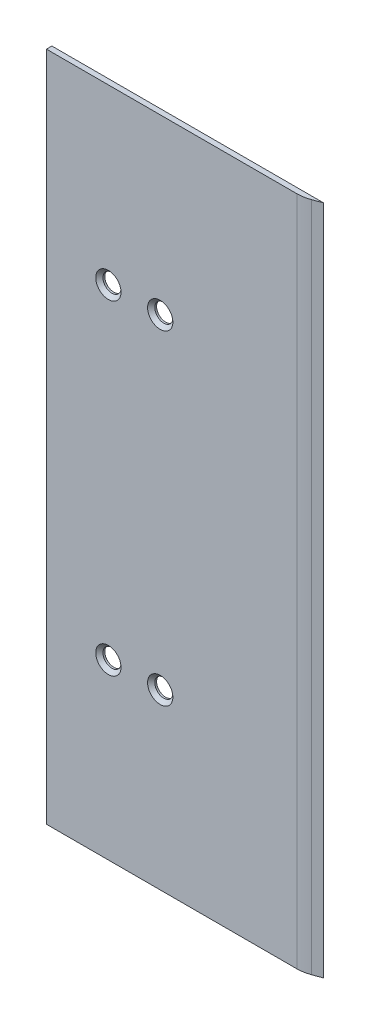
ISO-10303-21;
HEADER;
FILE_DESCRIPTION(('STEP AP214'),'2;1');
FILE_NAME('part.step','',(''),(''),'','','');
FILE_SCHEMA(('AUTOMOTIVE_DESIGN { 1 0 10303 214 1 1 1 1 }'));
ENDSEC;
DATA;
#1=APPLICATION_CONTEXT('core data for automotive mechanical design processes');
#2=APPLICATION_PROTOCOL_DEFINITION('international standard','automotive_design',2000,#1);
#3=PRODUCT_CONTEXT('',#1,'mechanical');
#4=PRODUCT('Part','Part','',(#3));
#5=PRODUCT_RELATED_PRODUCT_CATEGORY('part','',(#4));
#6=PRODUCT_DEFINITION_FORMATION('','',#4);
#7=PRODUCT_DEFINITION_CONTEXT('part definition',#1,'design');
#8=PRODUCT_DEFINITION('design','',#6,#7);
#9=PRODUCT_DEFINITION_SHAPE('','',#8);
#10=(LENGTH_UNIT() NAMED_UNIT(*) SI_UNIT(.MILLI.,.METRE.));
#11=(NAMED_UNIT(*) PLANE_ANGLE_UNIT() SI_UNIT($,.RADIAN.));
#12=(NAMED_UNIT(*) SI_UNIT($,.STERADIAN.) SOLID_ANGLE_UNIT());
#13=UNCERTAINTY_MEASURE_WITH_UNIT(LENGTH_MEASURE(1.E-05),#10,'distance_accuracy_value','');
#14=(GEOMETRIC_REPRESENTATION_CONTEXT(3) GLOBAL_UNCERTAINTY_ASSIGNED_CONTEXT((#13)) GLOBAL_UNIT_ASSIGNED_CONTEXT((#10,
#11,#12)) REPRESENTATION_CONTEXT('',''));
#15=CARTESIAN_POINT('',(0.,0.,0.));
#16=DIRECTION('',(0.,0.,1.));
#17=DIRECTION('',(1.,0.,0.));
#18=AXIS2_PLACEMENT_3D('',#15,#16,#17);
#19=CARTESIAN_POINT('',(0.,0.,1.5));
#20=DIRECTION('',(0.,0.,1.));
#21=DIRECTION('',(1.,0.,0.));
#22=AXIS2_PLACEMENT_3D('',#19,#20,#21);
#23=PLANE('',#22);
#24=CARTESIAN_POINT('',(-10.2070544195692,0.,1.5));
#25=DIRECTION('',(0.,0.,1.));
#26=DIRECTION('',(1.,0.,0.));
#27=AXIS2_PLACEMENT_3D('',#24,#25,#26);
#28=CIRCLE('',#27,3.50000000000003);
#29=CARTESIAN_POINT('',(-6.70705441956922,0.,1.5));
#30=VERTEX_POINT('',#29);
#31=EDGE_CURVE('E144',#30,#30,#28,.F.);
#32=ORIENTED_EDGE('',*,*,#31,.T.);
#33=EDGE_LOOP('',(#32));
#34=FACE_BOUND('',#33,.T.);
#35=CARTESIAN_POINT('',(4.15322718160443,0.,1.5));
#36=DIRECTION('',(0.,0.,1.));
#37=DIRECTION('',(1.,0.,0.));
#38=AXIS2_PLACEMENT_3D('',#35,#36,#37);
#39=CIRCLE('',#38,3.50000000000003);
#40=CARTESIAN_POINT('',(7.65322718160446,0.,1.5));
#41=VERTEX_POINT('',#40);
#42=EDGE_CURVE('E141',#41,#41,#39,.F.);
#43=ORIENTED_EDGE('',*,*,#42,.T.);
#44=EDGE_LOOP('',(#43));
#45=FACE_BOUND('',#44,.T.);
#46=CARTESIAN_POINT('',(-10.2070544195692,90.,1.5));
#47=DIRECTION('',(0.,0.,1.));
#48=DIRECTION('',(1.,0.,0.));
#49=AXIS2_PLACEMENT_3D('',#46,#47,#48);
#50=CIRCLE('',#49,3.50000000000003);
#51=CARTESIAN_POINT('',(-6.70705441956918,90.,1.5));
#52=VERTEX_POINT('',#51);
#53=EDGE_CURVE('E138',#52,#52,#50,.F.);
#54=ORIENTED_EDGE('',*,*,#53,.T.);
#55=EDGE_LOOP('',(#54));
#56=FACE_BOUND('',#55,.T.);
#57=CARTESIAN_POINT('',(4.15322718160446,90.,1.5));
#58=DIRECTION('',(0.,0.,1.));
#59=DIRECTION('',(1.,0.,0.));
#60=AXIS2_PLACEMENT_3D('',#57,#58,#59);
#61=CIRCLE('',#60,3.50000000000003);
#62=CARTESIAN_POINT('',(7.65322718160449,90.,1.5));
#63=VERTEX_POINT('',#62);
#64=EDGE_CURVE('E135',#63,#63,#61,.F.);
#65=ORIENTED_EDGE('',*,*,#64,.T.);
#66=EDGE_LOOP('',(#65));
#67=FACE_BOUND('',#66,.T.);
#68=DIRECTION('',(1.,0.,0.));
#69=VECTOR('',#68,1.);
#70=CARTESIAN_POINT('',(47.9127671645597,-48.,1.5));
#71=LINE('',#70,#69);
#72=CARTESIAN_POINT('',(-27.3701682781071,-48.,1.5));
#73=VERTEX_POINT('',#72);
#74=CARTESIAN_POINT('',(42.0282812282931,-48.,1.5));
#75=VERTEX_POINT('',#74);
#76=EDGE_CURVE('E110',#73,#75,#71,.T.);
#77=ORIENTED_EDGE('',*,*,#76,.T.);
#78=DIRECTION('',(0.,1.,0.));
#79=VECTOR('',#78,1.);
#80=CARTESIAN_POINT('',(42.0282812282931,0.,1.5));
#81=LINE('',#80,#79);
#82=CARTESIAN_POINT('',(42.0282812282931,138.,1.5));
#83=VERTEX_POINT('',#82);
#84=EDGE_CURVE('E94',#75,#83,#81,.T.);
#85=ORIENTED_EDGE('',*,*,#84,.T.);
#86=DIRECTION('',(-1.,0.,0.));
#87=VECTOR('',#86,1.);
#88=CARTESIAN_POINT('',(47.9127671645597,138.,1.5));
#89=LINE('',#88,#87);
#90=CARTESIAN_POINT('',(-27.3701682781071,138.,1.5));
#91=VERTEX_POINT('',#90);
#92=EDGE_CURVE('E87',#83,#91,#89,.T.);
#93=ORIENTED_EDGE('',*,*,#92,.T.);
#94=DIRECTION('',(0.,-1.,0.));
#95=VECTOR('',#94,1.);
#96=CARTESIAN_POINT('',(-27.3701682781071,-48.,1.5));
#97=LINE('',#96,#95);
#98=EDGE_CURVE('E91',#91,#73,#97,.T.);
#99=ORIENTED_EDGE('',*,*,#98,.T.);
#100=EDGE_LOOP('',(#77,#85,#93,#99));
#101=FACE_BOUND('',#100,.T.);
#102=ADVANCED_FACE('F39',(#34,#45,#56,#67,#101),#23,.T.);
#103=CARTESIAN_POINT('',(0.,0.,0.));
#104=DIRECTION('',(0.,0.,1.));
#105=DIRECTION('',(1.,0.,0.));
#106=AXIS2_PLACEMENT_3D('',#103,#104,#105);
#107=PLANE('',#106);
#108=DIRECTION('',(0.,1.,0.));
#109=VECTOR('',#108,1.);
#110=CARTESIAN_POINT('',(47.9127671645597,-48.,0.));
#111=LINE('',#110,#109);
#112=CARTESIAN_POINT('',(47.9127671645597,-48.,0.));
#113=VERTEX_POINT('',#112);
#114=CARTESIAN_POINT('',(47.9127671645597,138.,0.));
#115=VERTEX_POINT('',#114);
#116=EDGE_CURVE('E115',#113,#115,#111,.T.);
#117=ORIENTED_EDGE('',*,*,#116,.F.);
#118=DIRECTION('',(1.,0.,0.));
#119=VECTOR('',#118,1.);
#120=CARTESIAN_POINT('',(47.9127671645597,-48.,0.));
#121=LINE('',#120,#119);
#122=CARTESIAN_POINT('',(-27.3701682781071,-48.,0.));
#123=VERTEX_POINT('',#122);
#124=EDGE_CURVE('E95',#123,#113,#121,.T.);
#125=ORIENTED_EDGE('',*,*,#124,.F.);
#126=DIRECTION('',(0.,-1.,0.));
#127=VECTOR('',#126,1.);
#128=CARTESIAN_POINT('',(-27.3701682781071,-48.,0.));
#129=LINE('',#128,#127);
#130=CARTESIAN_POINT('',(-27.3701682781071,138.,0.));
#131=VERTEX_POINT('',#130);
#132=EDGE_CURVE('E120',#131,#123,#129,.T.);
#133=ORIENTED_EDGE('',*,*,#132,.F.);
#134=DIRECTION('',(-1.,0.,0.));
#135=VECTOR('',#134,1.);
#136=CARTESIAN_POINT('',(47.9127671645597,138.,0.));
#137=LINE('',#136,#135);
#138=EDGE_CURVE('E101',#115,#131,#137,.T.);
#139=ORIENTED_EDGE('',*,*,#138,.F.);
#140=EDGE_LOOP('',(#117,#125,#133,#139));
#141=FACE_BOUND('',#140,.T.);
#142=CARTESIAN_POINT('',(-10.2070544195692,90.,0.));
#143=DIRECTION('',(0.,0.,1.));
#144=DIRECTION('',(1.,0.,0.));
#145=AXIS2_PLACEMENT_3D('',#142,#143,#144);
#146=CIRCLE('',#145,2.49999999999999);
#147=CARTESIAN_POINT('',(-7.70705441956921,90.,0.));
#148=VERTEX_POINT('',#147);
#149=EDGE_CURVE('E118',#148,#148,#146,.T.);
#150=ORIENTED_EDGE('',*,*,#149,.T.);
#151=EDGE_LOOP('',(#150));
#152=FACE_BOUND('',#151,.T.);
#153=CARTESIAN_POINT('',(4.15322718160446,90.,0.));
#154=DIRECTION('',(0.,0.,1.));
#155=DIRECTION('',(1.,0.,0.));
#156=AXIS2_PLACEMENT_3D('',#153,#154,#155);
#157=CIRCLE('',#156,2.50000000000001);
#158=CARTESIAN_POINT('',(6.65322718160447,90.,0.));
#159=VERTEX_POINT('',#158);
#160=EDGE_CURVE('E228',#159,#159,#157,.T.);
#161=ORIENTED_EDGE('',*,*,#160,.T.);
#162=EDGE_LOOP('',(#161));
#163=FACE_BOUND('',#162,.T.);
#164=CARTESIAN_POINT('',(-10.2070544195692,0.,0.));
#165=DIRECTION('',(0.,0.,1.));
#166=DIRECTION('',(1.,0.,0.));
#167=AXIS2_PLACEMENT_3D('',#164,#165,#166);
#168=CIRCLE('',#167,2.5);
#169=CARTESIAN_POINT('',(-7.70705441956925,0.,0.));
#170=VERTEX_POINT('',#169);
#171=EDGE_CURVE('E226',#170,#170,#168,.T.);
#172=ORIENTED_EDGE('',*,*,#171,.T.);
#173=EDGE_LOOP('',(#172));
#174=FACE_BOUND('',#173,.T.);
#175=CARTESIAN_POINT('',(4.15322718160443,0.,0.));
#176=DIRECTION('',(0.,0.,1.));
#177=DIRECTION('',(1.,0.,0.));
#178=AXIS2_PLACEMENT_3D('',#175,#176,#177);
#179=CIRCLE('',#178,2.5);
#180=CARTESIAN_POINT('',(6.65322718160443,0.,0.));
#181=VERTEX_POINT('',#180);
#182=EDGE_CURVE('E229',#181,#181,#179,.T.);
#183=ORIENTED_EDGE('',*,*,#182,.T.);
#184=EDGE_LOOP('',(#183));
#185=FACE_BOUND('',#184,.T.);
#186=ADVANCED_FACE('F170',(#141,#152,#163,#174,#185),#107,.F.);
#187=CARTESIAN_POINT('',(47.9127671645597,138.,1.5));
#188=DIRECTION('',(0.,-1.,0.));
#189=DIRECTION('',(0.,0.,-1.));
#190=AXIS2_PLACEMENT_3D('',#187,#188,#189);
#191=PLANE('',#190);
#192=ORIENTED_EDGE('',*,*,#92,.F.);
#193=CARTESIAN_POINT('',(42.0282812282931,138.,-8.5));
#194=DIRECTION('',(0.,-1.,0.));
#195=DIRECTION('',(0.,0.,-1.));
#196=AXIS2_PLACEMENT_3D('',#193,#194,#195);
#197=CIRCLE('',#196,10.);
#198=CARTESIAN_POINT('',(45.4484826615498,138.,0.89692620785908));
#199=VERTEX_POINT('',#198);
#200=EDGE_CURVE('E63',#83,#199,#197,.F.);
#201=ORIENTED_EDGE('',*,*,#200,.T.);
#202=DIRECTION('',(0.939692620785908,0.,-0.34202014332567));
#203=VECTOR('',#202,1.);
#204=CARTESIAN_POINT('',(43.7915510353777,138.,1.5));
#205=LINE('',#204,#203);
#206=EDGE_CURVE('E104',#199,#115,#205,.T.);
#207=ORIENTED_EDGE('',*,*,#206,.T.);
#208=ORIENTED_EDGE('',*,*,#138,.T.);
#209=DIRECTION('',(0.,0.,-1.));
#210=VECTOR('',#209,1.);
#211=CARTESIAN_POINT('',(-27.3701682781071,138.,1.5));
#212=LINE('',#211,#210);
#213=EDGE_CURVE('E98',#91,#131,#212,.T.);
#214=ORIENTED_EDGE('',*,*,#213,.F.);
#215=EDGE_LOOP('',(#192,#201,#207,#208,#214));
#216=FACE_BOUND('',#215,.T.);
#217=ADVANCED_FACE('F99',(#216),#191,.F.);
#218=CARTESIAN_POINT('',(-27.3701682781071,-48.,1.5));
#219=DIRECTION('',(1.,0.,0.));
#220=DIRECTION('',(0.,1.,0.));
#221=AXIS2_PLACEMENT_3D('',#218,#219,#220);
#222=PLANE('',#221);
#223=ORIENTED_EDGE('',*,*,#132,.T.);
#224=DIRECTION('',(0.,0.,-1.));
#225=VECTOR('',#224,1.);
#226=CARTESIAN_POINT('',(-27.3701682781071,-48.,1.5));
#227=LINE('',#226,#225);
#228=EDGE_CURVE('E105',#73,#123,#227,.T.);
#229=ORIENTED_EDGE('',*,*,#228,.F.);
#230=ORIENTED_EDGE('',*,*,#98,.F.);
#231=ORIENTED_EDGE('',*,*,#213,.T.);
#232=EDGE_LOOP('',(#223,#229,#230,#231));
#233=FACE_BOUND('',#232,.T.);
#234=ADVANCED_FACE('F107',(#233),#222,.F.);
#235=CARTESIAN_POINT('',(47.9127671645597,-48.,1.5));
#236=DIRECTION('',(0.,1.,0.));
#237=DIRECTION('',(-1.,0.,0.));
#238=AXIS2_PLACEMENT_3D('',#235,#236,#237);
#239=PLANE('',#238);
#240=DIRECTION('',(-0.939692620785908,0.,0.34202014332567));
#241=VECTOR('',#240,1.);
#242=CARTESIAN_POINT('',(43.7915510353778,-48.,1.5));
#243=LINE('',#242,#241);
#244=CARTESIAN_POINT('',(45.4484826615498,-48.,0.896926207859081));
#245=VERTEX_POINT('',#244);
#246=EDGE_CURVE('E125',#113,#245,#243,.T.);
#247=ORIENTED_EDGE('',*,*,#246,.T.);
#248=CARTESIAN_POINT('',(42.0282812282931,-48.,-8.5));
#249=DIRECTION('',(0.,1.,0.));
#250=DIRECTION('',(-1.,0.,0.));
#251=AXIS2_PLACEMENT_3D('',#248,#249,#250);
#252=CIRCLE('',#251,10.);
#253=EDGE_CURVE('E130',#245,#75,#252,.F.);
#254=ORIENTED_EDGE('',*,*,#253,.T.);
#255=ORIENTED_EDGE('',*,*,#76,.F.);
#256=ORIENTED_EDGE('',*,*,#228,.T.);
#257=ORIENTED_EDGE('',*,*,#124,.T.);
#258=EDGE_LOOP('',(#247,#254,#255,#256,#257));
#259=FACE_BOUND('',#258,.T.);
#260=ADVANCED_FACE('F182',(#259),#239,.F.);
#261=CARTESIAN_POINT('',(-10.2070544195692,90.,1.5));
#262=DIRECTION('',(0.,0.,-1.));
#263=DIRECTION('',(-1.,0.,0.));
#264=AXIS2_PLACEMENT_3D('',#261,#262,#263);
#265=CYLINDRICAL_SURFACE('',#264,2.49999999999999);
#266=CARTESIAN_POINT('',(-10.2070544195692,90.,0.499999999999983));
#267=DIRECTION('',(0.,0.,1.));
#268=DIRECTION('',(1.,0.,0.));
#269=AXIS2_PLACEMENT_3D('',#266,#267,#268);
#270=CIRCLE('',#269,2.49999999999999);
#271=CARTESIAN_POINT('',(-7.70705441956921,90.,0.499999999999983));
#272=VERTEX_POINT('',#271);
#273=EDGE_CURVE('E48',#272,#272,#270,.T.);
#274=ORIENTED_EDGE('',*,*,#273,.T.);
#275=EDGE_LOOP('',(#274));
#276=FACE_BOUND('',#275,.T.);
#277=ORIENTED_EDGE('',*,*,#149,.F.);
#278=EDGE_LOOP('',(#277));
#279=FACE_BOUND('',#278,.T.);
#280=ADVANCED_FACE('F152',(#276,#279),#265,.F.);
#281=CARTESIAN_POINT('',(4.15322718160446,90.,1.5));
#282=DIRECTION('',(0.,0.,-1.));
#283=DIRECTION('',(-1.,0.,0.));
#284=AXIS2_PLACEMENT_3D('',#281,#282,#283);
#285=CYLINDRICAL_SURFACE('',#284,2.50000000000001);
#286=CARTESIAN_POINT('',(4.15322718160446,90.,0.499999999999997));
#287=DIRECTION('',(0.,0.,1.));
#288=DIRECTION('',(1.,0.,0.));
#289=AXIS2_PLACEMENT_3D('',#286,#287,#288);
#290=CIRCLE('',#289,2.50000000000001);
#291=CARTESIAN_POINT('',(6.65322718160447,90.,0.499999999999997));
#292=VERTEX_POINT('',#291);
#293=EDGE_CURVE('E11',#292,#292,#290,.T.);
#294=ORIENTED_EDGE('',*,*,#293,.T.);
#295=EDGE_LOOP('',(#294));
#296=FACE_BOUND('',#295,.T.);
#297=ORIENTED_EDGE('',*,*,#160,.F.);
#298=EDGE_LOOP('',(#297));
#299=FACE_BOUND('',#298,.T.);
#300=ADVANCED_FACE('F222',(#296,#299),#285,.F.);
#301=CARTESIAN_POINT('',(-10.2070544195692,0.,1.5));
#302=DIRECTION('',(0.,0.,-1.));
#303=DIRECTION('',(-1.,0.,0.));
#304=AXIS2_PLACEMENT_3D('',#301,#302,#303);
#305=CYLINDRICAL_SURFACE('',#304,2.5);
#306=CARTESIAN_POINT('',(-10.2070544195692,0.,0.49999999999999));
#307=DIRECTION('',(0.,0.,1.));
#308=DIRECTION('',(1.,0.,0.));
#309=AXIS2_PLACEMENT_3D('',#306,#307,#308);
#310=CIRCLE('',#309,2.5);
#311=CARTESIAN_POINT('',(-7.70705441956925,0.,0.49999999999999));
#312=VERTEX_POINT('',#311);
#313=EDGE_CURVE('E132',#312,#312,#310,.T.);
#314=ORIENTED_EDGE('',*,*,#313,.T.);
#315=EDGE_LOOP('',(#314));
#316=FACE_BOUND('',#315,.T.);
#317=ORIENTED_EDGE('',*,*,#171,.F.);
#318=EDGE_LOOP('',(#317));
#319=FACE_BOUND('',#318,.T.);
#320=ADVANCED_FACE('F219',(#316,#319),#305,.F.);
#321=CARTESIAN_POINT('',(4.15322718160443,0.,1.5));
#322=DIRECTION('',(0.,0.,-1.));
#323=DIRECTION('',(-1.,0.,0.));
#324=AXIS2_PLACEMENT_3D('',#321,#322,#323);
#325=CYLINDRICAL_SURFACE('',#324,2.5);
#326=CARTESIAN_POINT('',(4.15322718160443,0.,0.49999999999999));
#327=DIRECTION('',(0.,0.,1.));
#328=DIRECTION('',(1.,0.,0.));
#329=AXIS2_PLACEMENT_3D('',#326,#327,#328);
#330=CIRCLE('',#329,2.5);
#331=CARTESIAN_POINT('',(6.65322718160443,0.,0.49999999999999));
#332=VERTEX_POINT('',#331);
#333=EDGE_CURVE('E147',#332,#332,#330,.T.);
#334=ORIENTED_EDGE('',*,*,#333,.T.);
#335=EDGE_LOOP('',(#334));
#336=FACE_BOUND('',#335,.T.);
#337=ORIENTED_EDGE('',*,*,#182,.F.);
#338=EDGE_LOOP('',(#337));
#339=FACE_BOUND('',#338,.T.);
#340=ADVANCED_FACE('F198',(#336,#339),#325,.F.);
#341=CARTESIAN_POINT('',(43.7915510353777,0.,1.5));
#342=DIRECTION('',(0.34202014332567,0.,0.939692620785908));
#343=DIRECTION('',(0.,-1.,0.));
#344=AXIS2_PLACEMENT_3D('',#341,#342,#343);
#345=PLANE('',#344);
#346=ORIENTED_EDGE('',*,*,#206,.F.);
#347=DIRECTION('',(0.,1.,0.));
#348=VECTOR('',#347,1.);
#349=CARTESIAN_POINT('',(45.4484826615498,0.,0.89692620785908));
#350=LINE('',#349,#348);
#351=EDGE_CURVE('E55',#199,#245,#350,.F.);
#352=ORIENTED_EDGE('',*,*,#351,.T.);
#353=ORIENTED_EDGE('',*,*,#246,.F.);
#354=ORIENTED_EDGE('',*,*,#116,.T.);
#355=EDGE_LOOP('',(#346,#352,#353,#354));
#356=FACE_BOUND('',#355,.T.);
#357=ADVANCED_FACE('F191',(#356),#345,.T.);
#358=CARTESIAN_POINT('',(42.0282812282931,0.,-8.5));
#359=DIRECTION('',(0.,1.,0.));
#360=DIRECTION('',(0.,0.,1.));
#361=AXIS2_PLACEMENT_3D('',#358,#359,#360);
#362=CYLINDRICAL_SURFACE('',#361,10.);
#363=ORIENTED_EDGE('',*,*,#253,.F.);
#364=ORIENTED_EDGE('',*,*,#351,.F.);
#365=ORIENTED_EDGE('',*,*,#200,.F.);
#366=ORIENTED_EDGE('',*,*,#84,.F.);
#367=EDGE_LOOP('',(#363,#364,#365,#366));
#368=FACE_BOUND('',#367,.T.);
#369=ADVANCED_FACE('F197',(#368),#362,.T.);
#370=CARTESIAN_POINT('',(-10.2070544195692,0.,0.49999999999999));
#371=DIRECTION('',(0.,0.,1.));
#372=DIRECTION('',(1.,0.,0.));
#373=AXIS2_PLACEMENT_3D('',#370,#371,#372);
#374=CONICAL_SURFACE('',#373,2.5,0.785398163397458);
#375=ORIENTED_EDGE('',*,*,#31,.F.);
#376=EDGE_LOOP('',(#375));
#377=FACE_BOUND('',#376,.T.);
#378=ORIENTED_EDGE('',*,*,#313,.F.);
#379=EDGE_LOOP('',(#378));
#380=FACE_BOUND('',#379,.T.);
#381=ADVANCED_FACE('F164',(#377,#380),#374,.F.);
#382=CARTESIAN_POINT('',(4.15322718160443,0.,0.49999999999999));
#383=DIRECTION('',(0.,0.,1.));
#384=DIRECTION('',(1.,0.,0.));
#385=AXIS2_PLACEMENT_3D('',#382,#383,#384);
#386=CONICAL_SURFACE('',#385,2.5,0.785398163397458);
#387=ORIENTED_EDGE('',*,*,#42,.F.);
#388=EDGE_LOOP('',(#387));
#389=FACE_BOUND('',#388,.T.);
#390=ORIENTED_EDGE('',*,*,#333,.F.);
#391=EDGE_LOOP('',(#390));
#392=FACE_BOUND('',#391,.T.);
#393=ADVANCED_FACE('F157',(#389,#392),#386,.F.);
#394=CARTESIAN_POINT('',(-10.2070544195692,90.,0.499999999999983));
#395=DIRECTION('',(0.,0.,1.));
#396=DIRECTION('',(1.,0.,0.));
#397=AXIS2_PLACEMENT_3D('',#394,#395,#396);
#398=CONICAL_SURFACE('',#397,2.49999999999999,0.785398163397458);
#399=ORIENTED_EDGE('',*,*,#53,.F.);
#400=EDGE_LOOP('',(#399));
#401=FACE_BOUND('',#400,.T.);
#402=ORIENTED_EDGE('',*,*,#273,.F.);
#403=EDGE_LOOP('',(#402));
#404=FACE_BOUND('',#403,.T.);
#405=ADVANCED_FACE('F155',(#401,#404),#398,.F.);
#406=CARTESIAN_POINT('',(4.15322718160446,90.,0.499999999999997));
#407=DIRECTION('',(0.,0.,1.));
#408=DIRECTION('',(1.,0.,0.));
#409=AXIS2_PLACEMENT_3D('',#406,#407,#408);
#410=CONICAL_SURFACE('',#409,2.50000000000001,0.785398163397458);
#411=ORIENTED_EDGE('',*,*,#64,.F.);
#412=EDGE_LOOP('',(#411));
#413=FACE_BOUND('',#412,.T.);
#414=ORIENTED_EDGE('',*,*,#293,.F.);
#415=EDGE_LOOP('',(#414));
#416=FACE_BOUND('',#415,.T.);
#417=ADVANCED_FACE('F42',(#413,#416),#410,.F.);
#418=CLOSED_SHELL('',(#102,#186,#217,#234,#260,#280,#300,#320,#340,#357,#369,#381,#393,#405,#417));
#419=MANIFOLD_SOLID_BREP('B2',#418);
#420=ADVANCED_BREP_SHAPE_REPRESENTATION('',(#18,#419),#14);
#421=SHAPE_DEFINITION_REPRESENTATION(#9,#420);
ENDSEC;
END-ISO-10303-21;
